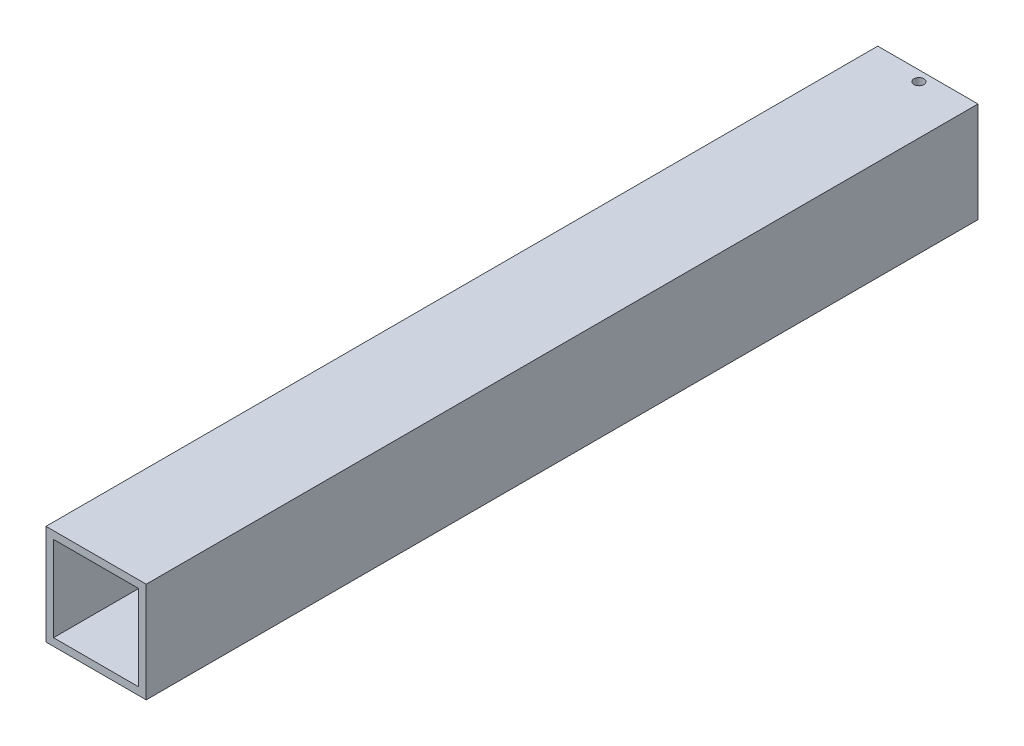
ISO-10303-21;
HEADER;
FILE_DESCRIPTION(('STEP AP214'),'2;1');
FILE_NAME('part.step','',(''),(''),'','','');
FILE_SCHEMA(('AUTOMOTIVE_DESIGN { 1 0 10303 214 1 1 1 1 }'));
ENDSEC;
DATA;
#1=APPLICATION_CONTEXT('core data for automotive mechanical design processes');
#2=APPLICATION_PROTOCOL_DEFINITION('international standard','automotive_design',2000,#1);
#3=PRODUCT_CONTEXT('',#1,'mechanical');
#4=PRODUCT('Part','Part','',(#3));
#5=PRODUCT_RELATED_PRODUCT_CATEGORY('part','',(#4));
#6=PRODUCT_DEFINITION_FORMATION('','',#4);
#7=PRODUCT_DEFINITION_CONTEXT('part definition',#1,'design');
#8=PRODUCT_DEFINITION('design','',#6,#7);
#9=PRODUCT_DEFINITION_SHAPE('','',#8);
#10=(LENGTH_UNIT() NAMED_UNIT(*) SI_UNIT(.MILLI.,.METRE.));
#11=(NAMED_UNIT(*) PLANE_ANGLE_UNIT() SI_UNIT($,.RADIAN.));
#12=(NAMED_UNIT(*) SI_UNIT($,.STERADIAN.) SOLID_ANGLE_UNIT());
#13=UNCERTAINTY_MEASURE_WITH_UNIT(LENGTH_MEASURE(1.E-05),#10,'distance_accuracy_value','');
#14=(GEOMETRIC_REPRESENTATION_CONTEXT(3) GLOBAL_UNCERTAINTY_ASSIGNED_CONTEXT((#13)) GLOBAL_UNIT_ASSIGNED_CONTEXT((#10,
#11,#12)) REPRESENTATION_CONTEXT('',''));
#15=CARTESIAN_POINT('',(0.,0.,0.));
#16=DIRECTION('',(0.,0.,1.));
#17=DIRECTION('',(1.,0.,0.));
#18=AXIS2_PLACEMENT_3D('',#15,#16,#17);
#19=CARTESIAN_POINT('',(-10.422988866238,18.5,194.284271247461));
#20=DIRECTION('',(-1.,0.,0.));
#21=DIRECTION('',(0.,-1.,0.));
#22=AXIS2_PLACEMENT_3D('',#19,#20,#21);
#23=PLANE('',#22);
#24=DIRECTION('',(0.,1.,0.));
#25=VECTOR('',#24,1.);
#26=CARTESIAN_POINT('',(-10.422988866238,18.5,165.999999999999));
#27=LINE('',#26,#25);
#28=CARTESIAN_POINT('',(-10.422988866238,-1.5,165.999999999999));
#29=VERTEX_POINT('',#28);
#30=CARTESIAN_POINT('',(-10.422988866238,18.5,165.999999999999));
#31=VERTEX_POINT('',#30);
#32=EDGE_CURVE('E11',#29,#31,#27,.T.);
#33=ORIENTED_EDGE('',*,*,#32,.F.);
#34=DIRECTION('',(0.,0.,-1.));
#35=VECTOR('',#34,1.);
#36=CARTESIAN_POINT('',(-10.422988866238,-1.5,194.284271247461));
#37=LINE('',#36,#35);
#38=CARTESIAN_POINT('',(-10.422988866238,-1.5,0.));
#39=VERTEX_POINT('',#38);
#40=EDGE_CURVE('E147',#29,#39,#37,.T.);
#41=ORIENTED_EDGE('',*,*,#40,.T.);
#42=DIRECTION('',(0.,1.,0.));
#43=VECTOR('',#42,1.);
#44=CARTESIAN_POINT('',(-10.422988866238,18.5,0.));
#45=LINE('',#44,#43);
#46=CARTESIAN_POINT('',(-10.422988866238,18.5,0.));
#47=VERTEX_POINT('',#46);
#48=EDGE_CURVE('E142',#39,#47,#45,.T.);
#49=ORIENTED_EDGE('',*,*,#48,.T.);
#50=DIRECTION('',(0.,0.,-1.));
#51=VECTOR('',#50,1.);
#52=CARTESIAN_POINT('',(-10.422988866238,18.5,194.284271247461));
#53=LINE('',#52,#51);
#54=EDGE_CURVE('E145',#31,#47,#53,.T.);
#55=ORIENTED_EDGE('',*,*,#54,.F.);
#56=EDGE_LOOP('',(#33,#41,#49,#55));
#57=FACE_BOUND('',#56,.T.);
#58=ADVANCED_FACE('F32',(#57),#23,.F.);
#59=CARTESIAN_POINT('',(-30.422988866238,-1.5,194.284271247461));
#60=DIRECTION('',(0.,1.,0.));
#61=DIRECTION('',(0.,0.,1.));
#62=AXIS2_PLACEMENT_3D('',#59,#60,#61);
#63=PLANE('',#62);
#64=CARTESIAN_POINT('',(-20.1716169837596,-1.5,2.04638998269502));
#65=DIRECTION('',(0.,1.,0.));
#66=DIRECTION('',(-1.,0.,0.));
#67=AXIS2_PLACEMENT_3D('',#64,#65,#66);
#68=CIRCLE('',#67,1.);
#69=CARTESIAN_POINT('',(-21.1716169837596,-1.50000000000001,2.04638998269502));
#70=VERTEX_POINT('',#69);
#71=EDGE_CURVE('E168',#70,#70,#68,.T.);
#72=ORIENTED_EDGE('',*,*,#71,.T.);
#73=EDGE_LOOP('',(#72));
#74=FACE_BOUND('',#73,.T.);
#75=DIRECTION('',(1.,0.,0.));
#76=VECTOR('',#75,1.);
#77=CARTESIAN_POINT('',(-30.422988866238,-1.5,165.999999999999));
#78=LINE('',#77,#76);
#79=CARTESIAN_POINT('',(-30.422988866238,-1.5,165.999999999999));
#80=VERTEX_POINT('',#79);
#81=EDGE_CURVE('E155',#80,#29,#78,.T.);
#82=ORIENTED_EDGE('',*,*,#81,.F.);
#83=DIRECTION('',(0.,0.,-1.));
#84=VECTOR('',#83,1.);
#85=CARTESIAN_POINT('',(-30.422988866238,-1.5,194.284271247461));
#86=LINE('',#85,#84);
#87=CARTESIAN_POINT('',(-30.422988866238,-1.5,0.));
#88=VERTEX_POINT('',#87);
#89=EDGE_CURVE('E149',#80,#88,#86,.T.);
#90=ORIENTED_EDGE('',*,*,#89,.T.);
#91=DIRECTION('',(1.,0.,0.));
#92=VECTOR('',#91,1.);
#93=CARTESIAN_POINT('',(-30.422988866238,-1.5,0.));
#94=LINE('',#93,#92);
#95=EDGE_CURVE('E139',#88,#39,#94,.T.);
#96=ORIENTED_EDGE('',*,*,#95,.T.);
#97=ORIENTED_EDGE('',*,*,#40,.F.);
#98=EDGE_LOOP('',(#82,#90,#96,#97));
#99=FACE_BOUND('',#98,.T.);
#100=ADVANCED_FACE('F191',(#74,#99),#63,.F.);
#101=CARTESIAN_POINT('',(-30.422988866238,18.5,194.284271247461));
#102=DIRECTION('',(1.,0.,0.));
#103=DIRECTION('',(0.,1.,0.));
#104=AXIS2_PLACEMENT_3D('',#101,#102,#103);
#105=PLANE('',#104);
#106=DIRECTION('',(0.,-1.,0.));
#107=VECTOR('',#106,1.);
#108=CARTESIAN_POINT('',(-30.422988866238,18.5,165.999999999999));
#109=LINE('',#108,#107);
#110=CARTESIAN_POINT('',(-30.422988866238,18.5,165.999999999999));
#111=VERTEX_POINT('',#110);
#112=EDGE_CURVE('E156',#111,#80,#109,.T.);
#113=ORIENTED_EDGE('',*,*,#112,.F.);
#114=DIRECTION('',(0.,0.,-1.));
#115=VECTOR('',#114,1.);
#116=CARTESIAN_POINT('',(-30.422988866238,18.5,194.284271247461));
#117=LINE('',#116,#115);
#118=CARTESIAN_POINT('',(-30.422988866238,18.5,0.));
#119=VERTEX_POINT('',#118);
#120=EDGE_CURVE('E151',#111,#119,#117,.T.);
#121=ORIENTED_EDGE('',*,*,#120,.T.);
#122=DIRECTION('',(0.,-1.,0.));
#123=VECTOR('',#122,1.);
#124=CARTESIAN_POINT('',(-30.422988866238,18.5,0.));
#125=LINE('',#124,#123);
#126=EDGE_CURVE('E136',#119,#88,#125,.T.);
#127=ORIENTED_EDGE('',*,*,#126,.T.);
#128=ORIENTED_EDGE('',*,*,#89,.F.);
#129=EDGE_LOOP('',(#113,#121,#127,#128));
#130=FACE_BOUND('',#129,.T.);
#131=ADVANCED_FACE('F197',(#130),#105,.F.);
#132=CARTESIAN_POINT('',(-30.422988866238,18.5,194.284271247461));
#133=DIRECTION('',(0.,-1.,0.));
#134=DIRECTION('',(1.,0.,0.));
#135=AXIS2_PLACEMENT_3D('',#132,#133,#134);
#136=PLANE('',#135);
#137=CARTESIAN_POINT('',(-20.1716169837596,18.5,2.04638998269502));
#138=DIRECTION('',(0.,1.,0.));
#139=DIRECTION('',(-1.,0.,0.));
#140=AXIS2_PLACEMENT_3D('',#137,#138,#139);
#141=CIRCLE('',#140,1.);
#142=CARTESIAN_POINT('',(-21.1716169837596,18.5,2.04638998269502));
#143=VERTEX_POINT('',#142);
#144=EDGE_CURVE('E165',#143,#143,#141,.T.);
#145=ORIENTED_EDGE('',*,*,#144,.F.);
#146=EDGE_LOOP('',(#145));
#147=FACE_BOUND('',#146,.T.);
#148=DIRECTION('',(-1.,0.,0.));
#149=VECTOR('',#148,1.);
#150=CARTESIAN_POINT('',(-30.422988866238,18.5,165.999999999999));
#151=LINE('',#150,#149);
#152=EDGE_CURVE('E48',#31,#111,#151,.T.);
#153=ORIENTED_EDGE('',*,*,#152,.F.);
#154=ORIENTED_EDGE('',*,*,#54,.T.);
#155=DIRECTION('',(-1.,0.,0.));
#156=VECTOR('',#155,1.);
#157=CARTESIAN_POINT('',(-30.422988866238,18.5,0.));
#158=LINE('',#157,#156);
#159=EDGE_CURVE('E105',#47,#119,#158,.T.);
#160=ORIENTED_EDGE('',*,*,#159,.T.);
#161=ORIENTED_EDGE('',*,*,#120,.F.);
#162=EDGE_LOOP('',(#153,#154,#160,#161));
#163=FACE_BOUND('',#162,.T.);
#164=ADVANCED_FACE('F34',(#147,#163),#136,.F.);
#165=CARTESIAN_POINT('',(0.,0.,0.));
#166=DIRECTION('',(0.,0.,-1.));
#167=DIRECTION('',(-1.,0.,0.));
#168=AXIS2_PLACEMENT_3D('',#165,#166,#167);
#169=PLANE('',#168);
#170=ORIENTED_EDGE('',*,*,#159,.F.);
#171=ORIENTED_EDGE('',*,*,#48,.F.);
#172=ORIENTED_EDGE('',*,*,#95,.F.);
#173=ORIENTED_EDGE('',*,*,#126,.F.);
#174=EDGE_LOOP('',(#170,#171,#172,#173));
#175=FACE_BOUND('',#174,.T.);
#176=DIRECTION('',(-1.,0.,0.));
#177=VECTOR('',#176,1.);
#178=CARTESIAN_POINT('',(-28.922988866238,17.,0.));
#179=LINE('',#178,#177);
#180=CARTESIAN_POINT('',(-11.922988866238,17.,0.));
#181=VERTEX_POINT('',#180);
#182=CARTESIAN_POINT('',(-28.922988866238,17.,0.));
#183=VERTEX_POINT('',#182);
#184=EDGE_CURVE('E119',#181,#183,#179,.T.);
#185=ORIENTED_EDGE('',*,*,#184,.T.);
#186=DIRECTION('',(0.,-1.,0.));
#187=VECTOR('',#186,1.);
#188=CARTESIAN_POINT('',(-28.922988866238,17.,0.));
#189=LINE('',#188,#187);
#190=CARTESIAN_POINT('',(-28.922988866238,0.,0.));
#191=VERTEX_POINT('',#190);
#192=EDGE_CURVE('E100',#183,#191,#189,.T.);
#193=ORIENTED_EDGE('',*,*,#192,.T.);
#194=DIRECTION('',(1.,0.,0.));
#195=VECTOR('',#194,1.);
#196=CARTESIAN_POINT('',(-28.922988866238,0.,0.));
#197=LINE('',#196,#195);
#198=CARTESIAN_POINT('',(-11.922988866238,0.,0.));
#199=VERTEX_POINT('',#198);
#200=EDGE_CURVE('E109',#191,#199,#197,.T.);
#201=ORIENTED_EDGE('',*,*,#200,.T.);
#202=DIRECTION('',(0.,1.,0.));
#203=VECTOR('',#202,1.);
#204=CARTESIAN_POINT('',(-11.922988866238,17.,0.));
#205=LINE('',#204,#203);
#206=EDGE_CURVE('E115',#199,#181,#205,.T.);
#207=ORIENTED_EDGE('',*,*,#206,.T.);
#208=EDGE_LOOP('',(#185,#193,#201,#207));
#209=FACE_BOUND('',#208,.T.);
#210=ADVANCED_FACE('F117',(#175,#209),#169,.T.);
#211=CARTESIAN_POINT('',(-28.922988866238,17.,194.284271247461));
#212=DIRECTION('',(0.,-1.,0.));
#213=DIRECTION('',(0.,0.,-1.));
#214=AXIS2_PLACEMENT_3D('',#211,#212,#213);
#215=PLANE('',#214);
#216=CARTESIAN_POINT('',(-20.1716169837596,17.,2.04638998269502));
#217=DIRECTION('',(0.,-1.,0.));
#218=DIRECTION('',(0.,0.,-1.));
#219=AXIS2_PLACEMENT_3D('',#216,#217,#218);
#220=CIRCLE('',#219,1.);
#221=CARTESIAN_POINT('',(-20.1716169837596,17.,1.04638998269502));
#222=VERTEX_POINT('',#221);
#223=EDGE_CURVE('E120',#222,#222,#220,.T.);
#224=ORIENTED_EDGE('',*,*,#223,.F.);
#225=EDGE_LOOP('',(#224));
#226=FACE_BOUND('',#225,.T.);
#227=DIRECTION('',(0.,0.,-1.));
#228=VECTOR('',#227,1.);
#229=CARTESIAN_POINT('',(-11.922988866238,17.,194.284271247461));
#230=LINE('',#229,#228);
#231=CARTESIAN_POINT('',(-11.922988866238,17.,165.999999999999));
#232=VERTEX_POINT('',#231);
#233=EDGE_CURVE('E131',#232,#181,#230,.T.);
#234=ORIENTED_EDGE('',*,*,#233,.F.);
#235=DIRECTION('',(-1.,0.,0.));
#236=VECTOR('',#235,1.);
#237=CARTESIAN_POINT('',(-28.922988866238,17.,165.999999999999));
#238=LINE('',#237,#236);
#239=CARTESIAN_POINT('',(-28.922988866238,17.,165.999999999999));
#240=VERTEX_POINT('',#239);
#241=EDGE_CURVE('E153',#232,#240,#238,.T.);
#242=ORIENTED_EDGE('',*,*,#241,.T.);
#243=DIRECTION('',(0.,0.,-1.));
#244=VECTOR('',#243,1.);
#245=CARTESIAN_POINT('',(-28.922988866238,17.,194.284271247461));
#246=LINE('',#245,#244);
#247=EDGE_CURVE('E129',#240,#183,#246,.T.);
#248=ORIENTED_EDGE('',*,*,#247,.T.);
#249=ORIENTED_EDGE('',*,*,#184,.F.);
#250=EDGE_LOOP('',(#234,#242,#248,#249));
#251=FACE_BOUND('',#250,.T.);
#252=ADVANCED_FACE('F187',(#226,#251),#215,.T.);
#253=CARTESIAN_POINT('',(-11.922988866238,17.,194.284271247461));
#254=DIRECTION('',(-1.,0.,0.));
#255=DIRECTION('',(0.,-1.,0.));
#256=AXIS2_PLACEMENT_3D('',#253,#254,#255);
#257=PLANE('',#256);
#258=DIRECTION('',(0.,0.,-1.));
#259=VECTOR('',#258,1.);
#260=CARTESIAN_POINT('',(-11.922988866238,0.,194.284271247461));
#261=LINE('',#260,#259);
#262=CARTESIAN_POINT('',(-11.922988866238,0.,165.999999999999));
#263=VERTEX_POINT('',#262);
#264=EDGE_CURVE('E106',#263,#199,#261,.T.);
#265=ORIENTED_EDGE('',*,*,#264,.F.);
#266=DIRECTION('',(0.,1.,0.));
#267=VECTOR('',#266,1.);
#268=CARTESIAN_POINT('',(-11.922988866238,17.,165.999999999999));
#269=LINE('',#268,#267);
#270=EDGE_CURVE('E42',#263,#232,#269,.T.);
#271=ORIENTED_EDGE('',*,*,#270,.T.);
#272=ORIENTED_EDGE('',*,*,#233,.T.);
#273=ORIENTED_EDGE('',*,*,#206,.F.);
#274=EDGE_LOOP('',(#265,#271,#272,#273));
#275=FACE_BOUND('',#274,.T.);
#276=ADVANCED_FACE('F179',(#275),#257,.T.);
#277=CARTESIAN_POINT('',(-28.922988866238,0.,194.284271247461));
#278=DIRECTION('',(0.,1.,0.));
#279=DIRECTION('',(0.,0.,1.));
#280=AXIS2_PLACEMENT_3D('',#277,#278,#279);
#281=PLANE('',#280);
#282=CARTESIAN_POINT('',(-20.1716169837596,0.,2.04638998269502));
#283=DIRECTION('',(0.,1.,0.));
#284=DIRECTION('',(0.,0.,1.));
#285=AXIS2_PLACEMENT_3D('',#282,#283,#284);
#286=CIRCLE('',#285,1.);
#287=CARTESIAN_POINT('',(-20.1716169837596,0.,3.04638998269502));
#288=VERTEX_POINT('',#287);
#289=EDGE_CURVE('E36',#288,#288,#286,.T.);
#290=ORIENTED_EDGE('',*,*,#289,.F.);
#291=EDGE_LOOP('',(#290));
#292=FACE_BOUND('',#291,.T.);
#293=DIRECTION('',(0.,0.,-1.));
#294=VECTOR('',#293,1.);
#295=CARTESIAN_POINT('',(-28.922988866238,0.,194.284271247461));
#296=LINE('',#295,#294);
#297=CARTESIAN_POINT('',(-28.922988866238,0.,165.999999999999));
#298=VERTEX_POINT('',#297);
#299=EDGE_CURVE('E95',#298,#191,#296,.T.);
#300=ORIENTED_EDGE('',*,*,#299,.F.);
#301=DIRECTION('',(1.,0.,0.));
#302=VECTOR('',#301,1.);
#303=CARTESIAN_POINT('',(-28.922988866238,0.,165.999999999999));
#304=LINE('',#303,#302);
#305=EDGE_CURVE('E161',#298,#263,#304,.T.);
#306=ORIENTED_EDGE('',*,*,#305,.T.);
#307=ORIENTED_EDGE('',*,*,#264,.T.);
#308=ORIENTED_EDGE('',*,*,#200,.F.);
#309=EDGE_LOOP('',(#300,#306,#307,#308));
#310=FACE_BOUND('',#309,.T.);
#311=ADVANCED_FACE('F110',(#292,#310),#281,.T.);
#312=CARTESIAN_POINT('',(-28.922988866238,17.,194.284271247461));
#313=DIRECTION('',(1.,0.,0.));
#314=DIRECTION('',(0.,1.,0.));
#315=AXIS2_PLACEMENT_3D('',#312,#313,#314);
#316=PLANE('',#315);
#317=ORIENTED_EDGE('',*,*,#247,.F.);
#318=DIRECTION('',(0.,-1.,0.));
#319=VECTOR('',#318,1.);
#320=CARTESIAN_POINT('',(-28.922988866238,17.,165.999999999999));
#321=LINE('',#320,#319);
#322=EDGE_CURVE('E102',#240,#298,#321,.T.);
#323=ORIENTED_EDGE('',*,*,#322,.T.);
#324=ORIENTED_EDGE('',*,*,#299,.T.);
#325=ORIENTED_EDGE('',*,*,#192,.F.);
#326=EDGE_LOOP('',(#317,#323,#324,#325));
#327=FACE_BOUND('',#326,.T.);
#328=ADVANCED_FACE('F98',(#327),#316,.T.);
#329=CARTESIAN_POINT('',(-30.4229888662381,-274.099637723642,165.999999999999));
#330=DIRECTION('',(0.,0.,1.));
#331=DIRECTION('',(0.,-1.,0.));
#332=AXIS2_PLACEMENT_3D('',#329,#330,#331);
#333=PLANE('',#332);
#334=ORIENTED_EDGE('',*,*,#241,.F.);
#335=ORIENTED_EDGE('',*,*,#270,.F.);
#336=ORIENTED_EDGE('',*,*,#305,.F.);
#337=ORIENTED_EDGE('',*,*,#322,.F.);
#338=EDGE_LOOP('',(#334,#335,#336,#337));
#339=FACE_BOUND('',#338,.T.);
#340=ORIENTED_EDGE('',*,*,#152,.T.);
#341=ORIENTED_EDGE('',*,*,#112,.T.);
#342=ORIENTED_EDGE('',*,*,#81,.T.);
#343=ORIENTED_EDGE('',*,*,#32,.T.);
#344=EDGE_LOOP('',(#340,#341,#342,#343));
#345=FACE_BOUND('',#344,.T.);
#346=ADVANCED_FACE('F185',(#339,#345),#333,.T.);
#347=CARTESIAN_POINT('',(-20.1716169837596,-1.5,2.04638998269502));
#348=DIRECTION('',(0.,1.,0.));
#349=DIRECTION('',(-1.,0.,0.));
#350=AXIS2_PLACEMENT_3D('',#347,#348,#349);
#351=CYLINDRICAL_SURFACE('',#350,1.);
#352=ORIENTED_EDGE('',*,*,#289,.T.);
#353=EDGE_LOOP('',(#352));
#354=FACE_BOUND('',#353,.T.);
#355=ORIENTED_EDGE('',*,*,#71,.F.);
#356=EDGE_LOOP('',(#355));
#357=FACE_BOUND('',#356,.T.);
#358=ADVANCED_FACE('F175',(#354,#357),#351,.F.);
#359=ORIENTED_EDGE('',*,*,#223,.T.);
#360=EDGE_LOOP('',(#359));
#361=FACE_BOUND('',#360,.T.);
#362=ORIENTED_EDGE('',*,*,#144,.T.);
#363=EDGE_LOOP('',(#362));
#364=FACE_BOUND('',#363,.T.);
#365=ADVANCED_FACE('F223',(#361,#364),#351,.F.);
#366=CLOSED_SHELL('',(#58,#100,#131,#164,#210,#252,#276,#311,#328,#346,#358,#365));
#367=MANIFOLD_SOLID_BREP('B2',#366);
#368=ADVANCED_BREP_SHAPE_REPRESENTATION('',(#18,#367),#14);
#369=SHAPE_DEFINITION_REPRESENTATION(#9,#368);
ENDSEC;
END-ISO-10303-21;
